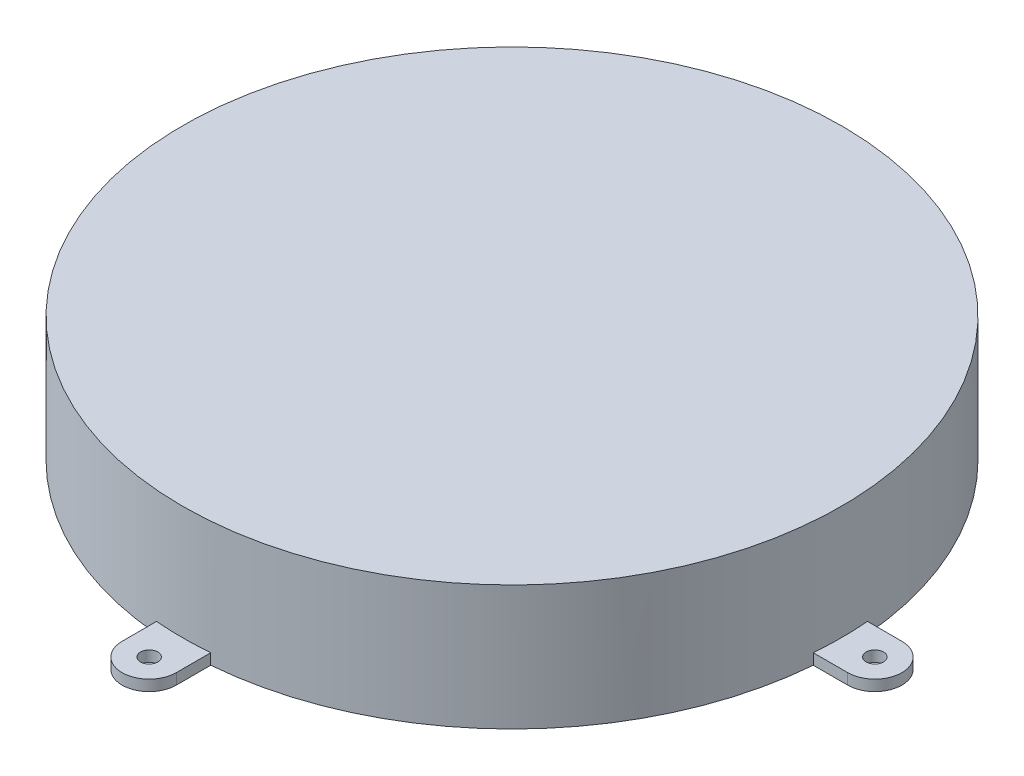
ISO-10303-21;
HEADER;
FILE_DESCRIPTION(('STEP AP214'),'2;1');
FILE_NAME('part.step','',(''),(''),'','','');
FILE_SCHEMA(('AUTOMOTIVE_DESIGN { 1 0 10303 214 1 1 1 1 }'));
ENDSEC;
DATA;
#1=APPLICATION_CONTEXT('core data for automotive mechanical design processes');
#2=APPLICATION_PROTOCOL_DEFINITION('international standard','automotive_design',2000,#1);
#3=PRODUCT_CONTEXT('',#1,'mechanical');
#4=PRODUCT('Part','Part','',(#3));
#5=PRODUCT_RELATED_PRODUCT_CATEGORY('part','',(#4));
#6=PRODUCT_DEFINITION_FORMATION('','',#4);
#7=PRODUCT_DEFINITION_CONTEXT('part definition',#1,'design');
#8=PRODUCT_DEFINITION('design','',#6,#7);
#9=PRODUCT_DEFINITION_SHAPE('','',#8);
#10=(LENGTH_UNIT() NAMED_UNIT(*) SI_UNIT(.MILLI.,.METRE.));
#11=(NAMED_UNIT(*) PLANE_ANGLE_UNIT() SI_UNIT($,.RADIAN.));
#12=(NAMED_UNIT(*) SI_UNIT($,.STERADIAN.) SOLID_ANGLE_UNIT());
#13=UNCERTAINTY_MEASURE_WITH_UNIT(LENGTH_MEASURE(1.E-05),#10,'distance_accuracy_value','');
#14=(GEOMETRIC_REPRESENTATION_CONTEXT(3) GLOBAL_UNCERTAINTY_ASSIGNED_CONTEXT((#13)) GLOBAL_UNIT_ASSIGNED_CONTEXT((#10,
#11,#12)) REPRESENTATION_CONTEXT('',''));
#15=CARTESIAN_POINT('',(0.,0.,0.));
#16=DIRECTION('',(0.,0.,1.));
#17=DIRECTION('',(1.,0.,0.));
#18=AXIS2_PLACEMENT_3D('',#15,#16,#17);
#19=CARTESIAN_POINT('',(0.,21.,0.));
#20=DIRECTION('',(0.,-1.,0.));
#21=DIRECTION('',(0.,0.,-1.));
#22=AXIS2_PLACEMENT_3D('',#19,#20,#21);
#23=CYLINDRICAL_SURFACE('',#22,60.75);
#24=CARTESIAN_POINT('',(0.,23.,0.));
#25=DIRECTION('',(0.,1.,0.));
#26=DIRECTION('',(0.,0.,1.));
#27=AXIS2_PLACEMENT_3D('',#24,#25,#26);
#28=CIRCLE('',#27,60.75);
#29=CARTESIAN_POINT('',(0.,23.,60.75));
#30=VERTEX_POINT('',#29);
#31=EDGE_CURVE('E268',#30,#30,#28,.T.);
#32=ORIENTED_EDGE('',*,*,#31,.F.);
#33=EDGE_LOOP('',(#32));
#34=FACE_BOUND('',#33,.T.);
#35=DIRECTION('',(0.,-1.,0.));
#36=VECTOR('',#35,1.);
#37=CARTESIAN_POINT('',(-60.5438890392746,2.,5.00000000000001));
#38=LINE('',#37,#36);
#39=CARTESIAN_POINT('',(-60.5438890392746,2.,5.00000000000003));
#40=VERTEX_POINT('',#39);
#41=CARTESIAN_POINT('',(-60.5438890392746,0.,5.00000000000003));
#42=VERTEX_POINT('',#41);
#43=EDGE_CURVE('E148',#40,#42,#38,.T.);
#44=ORIENTED_EDGE('',*,*,#43,.T.);
#45=CARTESIAN_POINT('',(0.,0.,0.));
#46=DIRECTION('',(0.,1.,0.));
#47=DIRECTION('',(0.,0.,1.));
#48=AXIS2_PLACEMENT_3D('',#45,#46,#47);
#49=CIRCLE('',#48,60.75);
#50=CARTESIAN_POINT('',(-4.99999999999999,0.,60.5438890392746));
#51=VERTEX_POINT('',#50);
#52=EDGE_CURVE('E281',#42,#51,#49,.T.);
#53=ORIENTED_EDGE('',*,*,#52,.T.);
#54=DIRECTION('',(0.,-1.,0.));
#55=VECTOR('',#54,1.);
#56=CARTESIAN_POINT('',(-4.99999999999999,2.,60.5438890392746));
#57=LINE('',#56,#55);
#58=CARTESIAN_POINT('',(-4.99999999999999,2.,60.5438890392746));
#59=VERTEX_POINT('',#58);
#60=EDGE_CURVE('E194',#59,#51,#57,.T.);
#61=ORIENTED_EDGE('',*,*,#60,.F.);
#62=CARTESIAN_POINT('',(0.,2.,0.));
#63=DIRECTION('',(0.,-1.,0.));
#64=DIRECTION('',(0.,0.,-1.));
#65=AXIS2_PLACEMENT_3D('',#62,#63,#64);
#66=CIRCLE('',#65,60.75);
#67=CARTESIAN_POINT('',(5.00000000000003,2.,60.5438890392746));
#68=VERTEX_POINT('',#67);
#69=EDGE_CURVE('E40',#68,#59,#66,.T.);
#70=ORIENTED_EDGE('',*,*,#69,.F.);
#71=DIRECTION('',(0.,-1.,0.));
#72=VECTOR('',#71,1.);
#73=CARTESIAN_POINT('',(5.,2.,60.5438890392746));
#74=LINE('',#73,#72);
#75=CARTESIAN_POINT('',(5.00000000000003,0.,60.5438890392746));
#76=VERTEX_POINT('',#75);
#77=EDGE_CURVE('E197',#68,#76,#74,.T.);
#78=ORIENTED_EDGE('',*,*,#77,.T.);
#79=CARTESIAN_POINT('',(60.5438890392746,0.,4.99999999999999));
#80=VERTEX_POINT('',#79);
#81=EDGE_CURVE('E304',#76,#80,#49,.T.);
#82=ORIENTED_EDGE('',*,*,#81,.T.);
#83=DIRECTION('',(0.,-1.,0.));
#84=VECTOR('',#83,1.);
#85=CARTESIAN_POINT('',(60.5438890392746,2.,4.99999999999999));
#86=LINE('',#85,#84);
#87=CARTESIAN_POINT('',(60.5438890392746,2.,4.99999999999999));
#88=VERTEX_POINT('',#87);
#89=EDGE_CURVE('E227',#88,#80,#86,.T.);
#90=ORIENTED_EDGE('',*,*,#89,.F.);
#91=CARTESIAN_POINT('',(0.,2.,0.));
#92=DIRECTION('',(0.,-1.,0.));
#93=DIRECTION('',(0.,0.,-1.));
#94=AXIS2_PLACEMENT_3D('',#91,#92,#93);
#95=CIRCLE('',#94,60.75);
#96=CARTESIAN_POINT('',(60.5438890392746,2.,-5.00000000000003));
#97=VERTEX_POINT('',#96);
#98=EDGE_CURVE('E284',#97,#88,#95,.T.);
#99=ORIENTED_EDGE('',*,*,#98,.F.);
#100=DIRECTION('',(0.,-1.,0.));
#101=VECTOR('',#100,1.);
#102=CARTESIAN_POINT('',(60.5438890392746,2.,-5.));
#103=LINE('',#102,#101);
#104=CARTESIAN_POINT('',(60.5438890392746,0.,-5.00000000000003));
#105=VERTEX_POINT('',#104);
#106=EDGE_CURVE('E230',#97,#105,#103,.T.);
#107=ORIENTED_EDGE('',*,*,#106,.T.);
#108=CARTESIAN_POINT('',(5.,0.,-60.5438890392746));
#109=VERTEX_POINT('',#108);
#110=EDGE_CURVE('E277',#105,#109,#49,.T.);
#111=ORIENTED_EDGE('',*,*,#110,.T.);
#112=DIRECTION('',(0.,-1.,0.));
#113=VECTOR('',#112,1.);
#114=CARTESIAN_POINT('',(5.,2.,-60.5438890392746));
#115=LINE('',#114,#113);
#116=CARTESIAN_POINT('',(5.,2.,-60.5438890392746));
#117=VERTEX_POINT('',#116);
#118=EDGE_CURVE('E260',#117,#109,#115,.T.);
#119=ORIENTED_EDGE('',*,*,#118,.F.);
#120=CARTESIAN_POINT('',(0.,2.,0.));
#121=DIRECTION('',(0.,-1.,0.));
#122=DIRECTION('',(0.,0.,-1.));
#123=AXIS2_PLACEMENT_3D('',#120,#121,#122);
#124=CIRCLE('',#123,60.75);
#125=CARTESIAN_POINT('',(-5.00000000000003,2.,-60.5438890392746));
#126=VERTEX_POINT('',#125);
#127=EDGE_CURVE('E280',#126,#117,#124,.T.);
#128=ORIENTED_EDGE('',*,*,#127,.F.);
#129=DIRECTION('',(0.,-1.,0.));
#130=VECTOR('',#129,1.);
#131=CARTESIAN_POINT('',(-5.,2.,-60.5438890392746));
#132=LINE('',#131,#130);
#133=CARTESIAN_POINT('',(-5.00000000000003,0.,-60.5438890392746));
#134=VERTEX_POINT('',#133);
#135=EDGE_CURVE('E263',#126,#134,#132,.T.);
#136=ORIENTED_EDGE('',*,*,#135,.T.);
#137=CARTESIAN_POINT('',(-60.5438890392746,0.,-4.99999999999998));
#138=VERTEX_POINT('',#137);
#139=EDGE_CURVE('E278',#134,#138,#49,.T.);
#140=ORIENTED_EDGE('',*,*,#139,.T.);
#141=DIRECTION('',(0.,-1.,0.));
#142=VECTOR('',#141,1.);
#143=CARTESIAN_POINT('',(-60.5438890392746,2.,-4.99999999999998));
#144=LINE('',#143,#142);
#145=CARTESIAN_POINT('',(-60.5438890392746,2.,-4.99999999999998));
#146=VERTEX_POINT('',#145);
#147=EDGE_CURVE('E50',#146,#138,#144,.T.);
#148=ORIENTED_EDGE('',*,*,#147,.F.);
#149=CARTESIAN_POINT('',(0.,2.,0.));
#150=DIRECTION('',(0.,-1.,0.));
#151=DIRECTION('',(0.,0.,-1.));
#152=AXIS2_PLACEMENT_3D('',#149,#150,#151);
#153=CIRCLE('',#152,60.75);
#154=EDGE_CURVE('E11',#40,#146,#153,.T.);
#155=ORIENTED_EDGE('',*,*,#154,.F.);
#156=EDGE_LOOP('',(#44,#53,#61,#70,#78,#82,#90,#99,#107,#111,#119,#128,#136,#140,#148,#155));
#157=FACE_BOUND('',#156,.T.);
#158=ADVANCED_FACE('F33',(#34,#157),#23,.T.);
#159=CARTESIAN_POINT('',(0.,0.,0.));
#160=DIRECTION('',(0.,1.,0.));
#161=DIRECTION('',(0.,0.,1.));
#162=AXIS2_PLACEMENT_3D('',#159,#160,#161);
#163=PLANE('',#162);
#164=ORIENTED_EDGE('',*,*,#52,.F.);
#165=DIRECTION('',(1.,0.,0.));
#166=VECTOR('',#165,1.);
#167=CARTESIAN_POINT('',(-60.5438890392746,0.,5.00000000000001));
#168=LINE('',#167,#166);
#169=CARTESIAN_POINT('',(-66.8938890392746,0.,5.00000000000001));
#170=VERTEX_POINT('',#169);
#171=EDGE_CURVE('E385',#170,#42,#168,.T.);
#172=ORIENTED_EDGE('',*,*,#171,.F.);
#173=CARTESIAN_POINT('',(-66.8938890392746,0.,0.));
#174=DIRECTION('',(0.,1.,0.));
#175=DIRECTION('',(0.,0.,-1.));
#176=AXIS2_PLACEMENT_3D('',#173,#174,#175);
#177=CIRCLE('',#176,5.);
#178=CARTESIAN_POINT('',(-66.8938890392746,0.,-4.99999999999999));
#179=VERTEX_POINT('',#178);
#180=EDGE_CURVE('E164',#179,#170,#177,.T.);
#181=ORIENTED_EDGE('',*,*,#180,.F.);
#182=DIRECTION('',(-1.,0.,0.));
#183=VECTOR('',#182,1.);
#184=CARTESIAN_POINT('',(-66.8938890392746,0.,-4.99999999999999));
#185=LINE('',#184,#183);
#186=EDGE_CURVE('E160',#138,#179,#185,.T.);
#187=ORIENTED_EDGE('',*,*,#186,.F.);
#188=ORIENTED_EDGE('',*,*,#139,.F.);
#189=DIRECTION('',(0.,0.,1.));
#190=VECTOR('',#189,1.);
#191=CARTESIAN_POINT('',(-5.,0.,-60.5438890392746));
#192=LINE('',#191,#190);
#193=CARTESIAN_POINT('',(-5.,0.,-66.8938890392746));
#194=VERTEX_POINT('',#193);
#195=EDGE_CURVE('E254',#194,#134,#192,.T.);
#196=ORIENTED_EDGE('',*,*,#195,.F.);
#197=CARTESIAN_POINT('',(0.,0.,-66.8938890392746));
#198=DIRECTION('',(0.,1.,0.));
#199=DIRECTION('',(0.,0.,-1.));
#200=AXIS2_PLACEMENT_3D('',#197,#198,#199);
#201=CIRCLE('',#200,5.);
#202=CARTESIAN_POINT('',(5.,0.,-66.8938890392746));
#203=VERTEX_POINT('',#202);
#204=EDGE_CURVE('E239',#203,#194,#201,.T.);
#205=ORIENTED_EDGE('',*,*,#204,.F.);
#206=DIRECTION('',(0.,0.,-1.));
#207=VECTOR('',#206,1.);
#208=CARTESIAN_POINT('',(5.,0.,-66.8938890392746));
#209=LINE('',#208,#207);
#210=EDGE_CURVE('E246',#109,#203,#209,.T.);
#211=ORIENTED_EDGE('',*,*,#210,.F.);
#212=ORIENTED_EDGE('',*,*,#110,.F.);
#213=DIRECTION('',(-1.,0.,0.));
#214=VECTOR('',#213,1.);
#215=CARTESIAN_POINT('',(60.5438890392746,0.,-5.));
#216=LINE('',#215,#214);
#217=CARTESIAN_POINT('',(66.8938890392746,0.,-5.));
#218=VERTEX_POINT('',#217);
#219=EDGE_CURVE('E221',#218,#105,#216,.T.);
#220=ORIENTED_EDGE('',*,*,#219,.F.);
#221=CARTESIAN_POINT('',(66.8938890392746,0.,0.));
#222=DIRECTION('',(0.,1.,0.));
#223=DIRECTION('',(0.,0.,-1.));
#224=AXIS2_PLACEMENT_3D('',#221,#222,#223);
#225=CIRCLE('',#224,5.);
#226=CARTESIAN_POINT('',(66.8938890392746,0.,5.));
#227=VERTEX_POINT('',#226);
#228=EDGE_CURVE('E206',#227,#218,#225,.T.);
#229=ORIENTED_EDGE('',*,*,#228,.F.);
#230=DIRECTION('',(1.,0.,0.));
#231=VECTOR('',#230,1.);
#232=CARTESIAN_POINT('',(66.8938890392746,0.,5.));
#233=LINE('',#232,#231);
#234=EDGE_CURVE('E213',#80,#227,#233,.T.);
#235=ORIENTED_EDGE('',*,*,#234,.F.);
#236=ORIENTED_EDGE('',*,*,#81,.F.);
#237=DIRECTION('',(0.,0.,-1.));
#238=VECTOR('',#237,1.);
#239=CARTESIAN_POINT('',(5.,0.,60.5438890392746));
#240=LINE('',#239,#238);
#241=CARTESIAN_POINT('',(5.00000000000001,0.,66.8938890392746));
#242=VERTEX_POINT('',#241);
#243=EDGE_CURVE('E188',#242,#76,#240,.T.);
#244=ORIENTED_EDGE('',*,*,#243,.F.);
#245=CARTESIAN_POINT('',(0.,0.,66.8938890392746));
#246=DIRECTION('',(0.,1.,0.));
#247=DIRECTION('',(0.,0.,-1.));
#248=AXIS2_PLACEMENT_3D('',#245,#246,#247);
#249=CIRCLE('',#248,5.);
#250=CARTESIAN_POINT('',(-4.99999999999999,0.,66.8938890392746));
#251=VERTEX_POINT('',#250);
#252=EDGE_CURVE('E174',#251,#242,#249,.T.);
#253=ORIENTED_EDGE('',*,*,#252,.F.);
#254=DIRECTION('',(0.,0.,1.));
#255=VECTOR('',#254,1.);
#256=CARTESIAN_POINT('',(-4.99999999999999,0.,66.8938890392746));
#257=LINE('',#256,#255);
#258=EDGE_CURVE('E180',#51,#251,#257,.T.);
#259=ORIENTED_EDGE('',*,*,#258,.F.);
#260=EDGE_LOOP('',(#164,#172,#181,#187,#188,#196,#205,#211,#212,#220,#229,#235,#236,#244,#253,#259));
#261=FACE_BOUND('',#260,.T.);
#262=CARTESIAN_POINT('',(0.,0.,66.8938890392746));
#263=DIRECTION('',(0.,1.,0.));
#264=DIRECTION('',(0.,0.,1.));
#265=AXIS2_PLACEMENT_3D('',#262,#263,#264);
#266=CIRCLE('',#265,1.60000000000024);
#267=CARTESIAN_POINT('',(0.,0.,68.4938890392749));
#268=VERTEX_POINT('',#267);
#269=EDGE_CURVE('E165',#268,#268,#266,.T.);
#270=ORIENTED_EDGE('',*,*,#269,.T.);
#271=EDGE_LOOP('',(#270));
#272=FACE_BOUND('',#271,.T.);
#273=CARTESIAN_POINT('',(0.,0.,0.));
#274=DIRECTION('',(0.,1.,0.));
#275=DIRECTION('',(0.,0.,1.));
#276=AXIS2_PLACEMENT_3D('',#273,#274,#275);
#277=CIRCLE('',#276,59.75);
#278=CARTESIAN_POINT('',(0.,0.,-59.75));
#279=VERTEX_POINT('',#278);
#280=EDGE_CURVE('E274',#279,#279,#277,.T.);
#281=ORIENTED_EDGE('',*,*,#280,.T.);
#282=EDGE_LOOP('',(#281));
#283=FACE_BOUND('',#282,.T.);
#284=CARTESIAN_POINT('',(0.,0.,-66.8938890392746));
#285=DIRECTION('',(0.,1.,0.));
#286=DIRECTION('',(0.,0.,1.));
#287=AXIS2_PLACEMENT_3D('',#284,#285,#286);
#288=CIRCLE('',#287,1.60000000000001);
#289=CARTESIAN_POINT('',(0.,0.,-65.2938890392746));
#290=VERTEX_POINT('',#289);
#291=EDGE_CURVE('E235',#290,#290,#288,.T.);
#292=ORIENTED_EDGE('',*,*,#291,.T.);
#293=EDGE_LOOP('',(#292));
#294=FACE_BOUND('',#293,.T.);
#295=CARTESIAN_POINT('',(66.8938890392746,0.,0.));
#296=DIRECTION('',(0.,1.,0.));
#297=DIRECTION('',(0.,0.,1.));
#298=AXIS2_PLACEMENT_3D('',#295,#296,#297);
#299=CIRCLE('',#298,1.60000000000031);
#300=CARTESIAN_POINT('',(66.8938890392746,0.,1.60000000000031));
#301=VERTEX_POINT('',#300);
#302=EDGE_CURVE('E202',#301,#301,#299,.T.);
#303=ORIENTED_EDGE('',*,*,#302,.T.);
#304=EDGE_LOOP('',(#303));
#305=FACE_BOUND('',#304,.T.);
#306=CARTESIAN_POINT('',(-66.8938890392746,0.,0.));
#307=DIRECTION('',(0.,1.,0.));
#308=DIRECTION('',(0.,0.,1.));
#309=AXIS2_PLACEMENT_3D('',#306,#307,#308);
#310=CIRCLE('',#309,1.60000000000001);
#311=CARTESIAN_POINT('',(-66.8938890392746,0.,1.60000000000002));
#312=VERTEX_POINT('',#311);
#313=EDGE_CURVE('E375',#312,#312,#310,.T.);
#314=ORIENTED_EDGE('',*,*,#313,.T.);
#315=EDGE_LOOP('',(#314));
#316=FACE_BOUND('',#315,.T.);
#317=ADVANCED_FACE('F308',(#261,#272,#283,#294,#305,#316),#163,.F.);
#318=CARTESIAN_POINT('',(0.,21.,0.));
#319=DIRECTION('',(0.,-1.,0.));
#320=DIRECTION('',(0.,0.,-1.));
#321=AXIS2_PLACEMENT_3D('',#318,#319,#320);
#322=CYLINDRICAL_SURFACE('',#321,59.75);
#323=CARTESIAN_POINT('',(0.,21.,0.));
#324=DIRECTION('',(0.,1.,0.));
#325=DIRECTION('',(0.,0.,1.));
#326=AXIS2_PLACEMENT_3D('',#323,#324,#325);
#327=CIRCLE('',#326,59.75);
#328=CARTESIAN_POINT('',(0.,21.,-59.75));
#329=VERTEX_POINT('',#328);
#330=EDGE_CURVE('E271',#329,#329,#327,.T.);
#331=CARTESIAN_POINT('',(0.,21.,-59.75));
#332=CARTESIAN_POINT('',(0.,20.78125,-59.75));
#333=CARTESIAN_POINT('',(0.,20.5625,-59.75));
#334=CARTESIAN_POINT('',(0.,20.125,-59.75));
#335=CARTESIAN_POINT('',(0.,19.90625,-59.75));
#336=CARTESIAN_POINT('',(0.,19.46875,-59.75));
#337=CARTESIAN_POINT('',(0.,19.25,-59.75));
#338=CARTESIAN_POINT('',(0.,18.8125,-59.75));
#339=CARTESIAN_POINT('',(0.,18.59375,-59.75));
#340=CARTESIAN_POINT('',(0.,18.15625,-59.75));
#341=CARTESIAN_POINT('',(0.,17.9375,-59.75));
#342=CARTESIAN_POINT('',(0.,17.5,-59.75));
#343=CARTESIAN_POINT('',(0.,17.28125,-59.75));
#344=CARTESIAN_POINT('',(0.,16.84375,-59.75));
#345=CARTESIAN_POINT('',(0.,16.625,-59.75));
#346=CARTESIAN_POINT('',(0.,16.1875,-59.75));
#347=CARTESIAN_POINT('',(0.,15.96875,-59.75));
#348=CARTESIAN_POINT('',(0.,15.53125,-59.75));
#349=CARTESIAN_POINT('',(0.,15.3125,-59.75));
#350=CARTESIAN_POINT('',(0.,14.875,-59.75));
#351=CARTESIAN_POINT('',(0.,14.65625,-59.75));
#352=CARTESIAN_POINT('',(0.,14.21875,-59.75));
#353=CARTESIAN_POINT('',(0.,14.,-59.75));
#354=CARTESIAN_POINT('',(0.,13.5625,-59.75));
#355=CARTESIAN_POINT('',(0.,13.34375,-59.75));
#356=CARTESIAN_POINT('',(0.,12.90625,-59.75));
#357=CARTESIAN_POINT('',(0.,12.6875,-59.75));
#358=CARTESIAN_POINT('',(0.,12.25,-59.75));
#359=CARTESIAN_POINT('',(0.,12.03125,-59.75));
#360=CARTESIAN_POINT('',(0.,11.59375,-59.75));
#361=CARTESIAN_POINT('',(0.,11.375,-59.75));
#362=CARTESIAN_POINT('',(0.,10.9375,-59.75));
#363=CARTESIAN_POINT('',(0.,10.71875,-59.75));
#364=CARTESIAN_POINT('',(0.,10.28125,-59.75));
#365=CARTESIAN_POINT('',(0.,10.0625,-59.75));
#366=CARTESIAN_POINT('',(0.,9.625,-59.75));
#367=CARTESIAN_POINT('',(0.,9.40625,-59.75));
#368=CARTESIAN_POINT('',(0.,8.96875,-59.75));
#369=CARTESIAN_POINT('',(0.,8.75,-59.75));
#370=CARTESIAN_POINT('',(0.,8.3125,-59.75));
#371=CARTESIAN_POINT('',(0.,8.09375,-59.75));
#372=CARTESIAN_POINT('',(0.,7.65625,-59.75));
#373=CARTESIAN_POINT('',(0.,7.4375,-59.75));
#374=CARTESIAN_POINT('',(0.,7.,-59.75));
#375=CARTESIAN_POINT('',(0.,6.78125,-59.75));
#376=CARTESIAN_POINT('',(0.,6.34375,-59.75));
#377=CARTESIAN_POINT('',(0.,6.125,-59.75));
#378=CARTESIAN_POINT('',(0.,5.6875,-59.75));
#379=CARTESIAN_POINT('',(0.,5.46875,-59.75));
#380=CARTESIAN_POINT('',(0.,5.03125,-59.75));
#381=CARTESIAN_POINT('',(0.,4.8125,-59.75));
#382=CARTESIAN_POINT('',(0.,4.375,-59.75));
#383=CARTESIAN_POINT('',(0.,4.15625,-59.75));
#384=CARTESIAN_POINT('',(0.,3.71875,-59.75));
#385=CARTESIAN_POINT('',(0.,3.5,-59.75));
#386=CARTESIAN_POINT('',(0.,3.0625,-59.75));
#387=CARTESIAN_POINT('',(0.,2.84375,-59.75));
#388=CARTESIAN_POINT('',(0.,2.40625,-59.75));
#389=CARTESIAN_POINT('',(0.,2.1875,-59.75));
#390=CARTESIAN_POINT('',(0.,1.75,-59.75));
#391=CARTESIAN_POINT('',(0.,1.53125,-59.75));
#392=CARTESIAN_POINT('',(0.,1.09375,-59.75));
#393=CARTESIAN_POINT('',(0.,0.875000000000001,-59.75));
#394=CARTESIAN_POINT('',(0.,0.4375,-59.75));
#395=CARTESIAN_POINT('',(0.,0.21875,-59.75));
#396=CARTESIAN_POINT('',(0.,0.,-59.75));
#397=B_SPLINE_CURVE_WITH_KNOTS('',3,(#331,#332,#333,#334,#335,#336,#337,#338,#339,#340,#341,
#342,#343,#344,#345,#346,#347,#348,#349,#350,#351,#352,#353,#354,#355,#356,#357,#358,#359,#360,
#361,#362,#363,#364,#365,#366,#367,#368,#369,#370,#371,#372,#373,#374,#375,#376,#377,#378,#379,
#380,#381,#382,#383,#384,#385,#386,#387,#388,#389,#390,#391,#392,#393,#394,#395,#396),
.UNSPECIFIED.,.F.,.F.,(4,2,2,2,2,2,2,2,2,2,2,2,2,2,2,2,2,2,2,2,2,2,2,2,2,2,2,2,2,2,2,2,4),(0.,
0.656249999999997,1.3125,1.96875,2.625,3.28125,3.9375,4.59375,5.25,5.90625,6.5625,7.21875,7.875,
8.53125,9.1875,9.84375,10.5,11.15625,11.8125,12.46875,13.125,13.78125,14.4375,15.09375,15.75,
16.40625,17.0625,17.71875,18.375,19.03125,19.6875,20.34375,21.),.UNSPECIFIED.);
#398=EDGE_CURVE('BSEAM345',#329,#279,#397,.T.);
#399=ORIENTED_EDGE('',*,*,#330,.T.);
#400=ORIENTED_EDGE('',*,*,#280,.F.);
#401=ORIENTED_EDGE('',*,*,#398,.T.);
#402=ORIENTED_EDGE('',*,*,#398,.F.);
#403=EDGE_LOOP('',(#399,#401,#400,#402));
#404=FACE_BOUND('',#403,.T.);
#405=ADVANCED_FACE('F345',(#404),#322,.F.);
#406=CARTESIAN_POINT('',(0.,21.,0.));
#407=DIRECTION('',(0.,1.,0.));
#408=DIRECTION('',(0.,0.,1.));
#409=AXIS2_PLACEMENT_3D('',#406,#407,#408);
#410=PLANE('',#409);
#411=ORIENTED_EDGE('',*,*,#330,.F.);
#412=EDGE_LOOP('',(#411));
#413=FACE_BOUND('',#412,.T.);
#414=ADVANCED_FACE('F350',(#413),#410,.F.);
#415=CARTESIAN_POINT('',(0.,23.,0.));
#416=DIRECTION('',(0.,1.,0.));
#417=DIRECTION('',(0.,0.,1.));
#418=AXIS2_PLACEMENT_3D('',#415,#416,#417);
#419=PLANE('',#418);
#420=ORIENTED_EDGE('',*,*,#31,.T.);
#421=EDGE_LOOP('',(#420));
#422=FACE_BOUND('',#421,.T.);
#423=ADVANCED_FACE('F348',(#422),#419,.T.);
#424=CARTESIAN_POINT('',(0.,2.,-66.8938890392746));
#425=DIRECTION('',(0.,-1.,0.));
#426=DIRECTION('',(0.,0.,-1.));
#427=AXIS2_PLACEMENT_3D('',#424,#425,#426);
#428=PLANE('',#427);
#429=DIRECTION('',(0.,0.,1.));
#430=VECTOR('',#429,1.);
#431=CARTESIAN_POINT('',(-5.,2.,-60.5438890392746));
#432=LINE('',#431,#430);
#433=CARTESIAN_POINT('',(-5.,2.,-66.8938890392746));
#434=VERTEX_POINT('',#433);
#435=EDGE_CURVE('E245',#434,#126,#432,.T.);
#436=ORIENTED_EDGE('',*,*,#435,.T.);
#437=ORIENTED_EDGE('',*,*,#127,.T.);
#438=DIRECTION('',(0.,0.,-1.));
#439=VECTOR('',#438,1.);
#440=CARTESIAN_POINT('',(5.,2.,-66.8938890392746));
#441=LINE('',#440,#439);
#442=CARTESIAN_POINT('',(5.,2.,-66.8938890392746));
#443=VERTEX_POINT('',#442);
#444=EDGE_CURVE('E249',#117,#443,#441,.T.);
#445=ORIENTED_EDGE('',*,*,#444,.T.);
#446=CARTESIAN_POINT('',(0.,2.,-66.8938890392746));
#447=DIRECTION('',(0.,1.,0.));
#448=DIRECTION('',(0.,0.,-1.));
#449=AXIS2_PLACEMENT_3D('',#446,#447,#448);
#450=CIRCLE('',#449,5.);
#451=EDGE_CURVE('E242',#443,#434,#450,.T.);
#452=ORIENTED_EDGE('',*,*,#451,.T.);
#453=EDGE_LOOP('',(#436,#437,#445,#452));
#454=FACE_BOUND('',#453,.T.);
#455=CARTESIAN_POINT('',(0.,2.,-66.8938890392746));
#456=DIRECTION('',(0.,1.,0.));
#457=DIRECTION('',(0.,0.,1.));
#458=AXIS2_PLACEMENT_3D('',#455,#456,#457);
#459=CIRCLE('',#458,1.60000000000001);
#460=CARTESIAN_POINT('',(0.,2.,-65.2938890392746));
#461=VERTEX_POINT('',#460);
#462=EDGE_CURVE('E236',#461,#461,#459,.T.);
#463=ORIENTED_EDGE('',*,*,#462,.F.);
#464=EDGE_LOOP('',(#463));
#465=FACE_BOUND('',#464,.T.);
#466=ADVANCED_FACE('F325',(#454,#465),#428,.F.);
#467=CARTESIAN_POINT('',(0.,2.,-66.8938890392746));
#468=DIRECTION('',(0.,-1.,0.));
#469=DIRECTION('',(0.,0.,-1.));
#470=AXIS2_PLACEMENT_3D('',#467,#468,#469);
#471=CYLINDRICAL_SURFACE('',#470,5.);
#472=ORIENTED_EDGE('',*,*,#204,.T.);
#473=DIRECTION('',(0.,-1.,0.));
#474=VECTOR('',#473,1.);
#475=CARTESIAN_POINT('',(-5.,2.,-66.8938890392746));
#476=LINE('',#475,#474);
#477=EDGE_CURVE('E265',#434,#194,#476,.T.);
#478=ORIENTED_EDGE('',*,*,#477,.F.);
#479=ORIENTED_EDGE('',*,*,#451,.F.);
#480=DIRECTION('',(0.,-1.,0.));
#481=VECTOR('',#480,1.);
#482=CARTESIAN_POINT('',(5.,2.,-66.8938890392746));
#483=LINE('',#482,#481);
#484=EDGE_CURVE('E251',#443,#203,#483,.T.);
#485=ORIENTED_EDGE('',*,*,#484,.T.);
#486=EDGE_LOOP('',(#472,#478,#479,#485));
#487=FACE_BOUND('',#486,.T.);
#488=ADVANCED_FACE('F322',(#487),#471,.T.);
#489=CARTESIAN_POINT('',(-5.,2.,-60.5438890392746));
#490=DIRECTION('',(1.,0.,0.));
#491=DIRECTION('',(0.,0.,-1.));
#492=AXIS2_PLACEMENT_3D('',#489,#490,#491);
#493=PLANE('',#492);
#494=ORIENTED_EDGE('',*,*,#195,.T.);
#495=ORIENTED_EDGE('',*,*,#135,.F.);
#496=ORIENTED_EDGE('',*,*,#435,.F.);
#497=ORIENTED_EDGE('',*,*,#477,.T.);
#498=EDGE_LOOP('',(#494,#495,#496,#497));
#499=FACE_BOUND('',#498,.T.);
#500=ADVANCED_FACE('F330',(#499),#493,.F.);
#501=CARTESIAN_POINT('',(5.,2.,-66.8938890392746));
#502=DIRECTION('',(-1.,0.,0.));
#503=DIRECTION('',(0.,0.,1.));
#504=AXIS2_PLACEMENT_3D('',#501,#502,#503);
#505=PLANE('',#504);
#506=ORIENTED_EDGE('',*,*,#210,.T.);
#507=ORIENTED_EDGE('',*,*,#484,.F.);
#508=ORIENTED_EDGE('',*,*,#444,.F.);
#509=ORIENTED_EDGE('',*,*,#118,.T.);
#510=EDGE_LOOP('',(#506,#507,#508,#509));
#511=FACE_BOUND('',#510,.T.);
#512=ADVANCED_FACE('F316',(#511),#505,.F.);
#513=CARTESIAN_POINT('',(0.,2.,-66.8938890392746));
#514=DIRECTION('',(0.,-1.,0.));
#515=DIRECTION('',(0.,0.,-1.));
#516=AXIS2_PLACEMENT_3D('',#513,#514,#515);
#517=CYLINDRICAL_SURFACE('',#516,1.60000000000001);
#518=ORIENTED_EDGE('',*,*,#462,.T.);
#519=EDGE_LOOP('',(#518));
#520=FACE_BOUND('',#519,.T.);
#521=ORIENTED_EDGE('',*,*,#291,.F.);
#522=EDGE_LOOP('',(#521));
#523=FACE_BOUND('',#522,.T.);
#524=ADVANCED_FACE('F337',(#520,#523),#517,.F.);
#525=CARTESIAN_POINT('',(66.8938890392746,2.,0.));
#526=DIRECTION('',(0.,-1.,0.));
#527=DIRECTION('',(0.,0.,-1.));
#528=AXIS2_PLACEMENT_3D('',#525,#526,#527);
#529=PLANE('',#528);
#530=DIRECTION('',(-1.,0.,0.));
#531=VECTOR('',#530,1.);
#532=CARTESIAN_POINT('',(60.5438890392746,2.,-5.));
#533=LINE('',#532,#531);
#534=CARTESIAN_POINT('',(66.8938890392746,2.,-5.));
#535=VERTEX_POINT('',#534);
#536=EDGE_CURVE('E212',#535,#97,#533,.T.);
#537=ORIENTED_EDGE('',*,*,#536,.T.);
#538=ORIENTED_EDGE('',*,*,#98,.T.);
#539=DIRECTION('',(1.,0.,0.));
#540=VECTOR('',#539,1.);
#541=CARTESIAN_POINT('',(66.8938890392746,2.,5.));
#542=LINE('',#541,#540);
#543=CARTESIAN_POINT('',(66.8938890392746,2.,5.));
#544=VERTEX_POINT('',#543);
#545=EDGE_CURVE('E216',#88,#544,#542,.T.);
#546=ORIENTED_EDGE('',*,*,#545,.T.);
#547=CARTESIAN_POINT('',(66.8938890392746,2.,0.));
#548=DIRECTION('',(0.,1.,0.));
#549=DIRECTION('',(0.,0.,-1.));
#550=AXIS2_PLACEMENT_3D('',#547,#548,#549);
#551=CIRCLE('',#550,5.);
#552=EDGE_CURVE('E209',#544,#535,#551,.T.);
#553=ORIENTED_EDGE('',*,*,#552,.T.);
#554=EDGE_LOOP('',(#537,#538,#546,#553));
#555=FACE_BOUND('',#554,.T.);
#556=CARTESIAN_POINT('',(66.8938890392746,2.,0.));
#557=DIRECTION('',(0.,1.,0.));
#558=DIRECTION('',(0.,0.,1.));
#559=AXIS2_PLACEMENT_3D('',#556,#557,#558);
#560=CIRCLE('',#559,1.60000000000031);
#561=CARTESIAN_POINT('',(66.8938890392746,2.,1.60000000000031));
#562=VERTEX_POINT('',#561);
#563=EDGE_CURVE('E203',#562,#562,#560,.T.);
#564=ORIENTED_EDGE('',*,*,#563,.F.);
#565=EDGE_LOOP('',(#564));
#566=FACE_BOUND('',#565,.T.);
#567=ADVANCED_FACE('F421',(#555,#566),#529,.F.);
#568=CARTESIAN_POINT('',(66.8938890392746,2.,0.));
#569=DIRECTION('',(0.,-1.,0.));
#570=DIRECTION('',(0.,0.,-1.));
#571=AXIS2_PLACEMENT_3D('',#568,#569,#570);
#572=CYLINDRICAL_SURFACE('',#571,5.);
#573=ORIENTED_EDGE('',*,*,#228,.T.);
#574=DIRECTION('',(0.,-1.,0.));
#575=VECTOR('',#574,1.);
#576=CARTESIAN_POINT('',(66.8938890392746,2.,-5.));
#577=LINE('',#576,#575);
#578=EDGE_CURVE('E232',#535,#218,#577,.T.);
#579=ORIENTED_EDGE('',*,*,#578,.F.);
#580=ORIENTED_EDGE('',*,*,#552,.F.);
#581=DIRECTION('',(0.,-1.,0.));
#582=VECTOR('',#581,1.);
#583=CARTESIAN_POINT('',(66.8938890392746,2.,5.));
#584=LINE('',#583,#582);
#585=EDGE_CURVE('E218',#544,#227,#584,.T.);
#586=ORIENTED_EDGE('',*,*,#585,.T.);
#587=EDGE_LOOP('',(#573,#579,#580,#586));
#588=FACE_BOUND('',#587,.T.);
#589=ADVANCED_FACE('F424',(#588),#572,.T.);
#590=CARTESIAN_POINT('',(60.5438890392746,2.,-5.));
#591=DIRECTION('',(0.,0.,1.));
#592=DIRECTION('',(1.,0.,0.));
#593=AXIS2_PLACEMENT_3D('',#590,#591,#592);
#594=PLANE('',#593);
#595=ORIENTED_EDGE('',*,*,#219,.T.);
#596=ORIENTED_EDGE('',*,*,#106,.F.);
#597=ORIENTED_EDGE('',*,*,#536,.F.);
#598=ORIENTED_EDGE('',*,*,#578,.T.);
#599=EDGE_LOOP('',(#595,#596,#597,#598));
#600=FACE_BOUND('',#599,.T.);
#601=ADVANCED_FACE('F428',(#600),#594,.F.);
#602=CARTESIAN_POINT('',(66.8938890392746,2.,5.));
#603=DIRECTION('',(0.,0.,-1.));
#604=DIRECTION('',(-1.,0.,0.));
#605=AXIS2_PLACEMENT_3D('',#602,#603,#604);
#606=PLANE('',#605);
#607=ORIENTED_EDGE('',*,*,#234,.T.);
#608=ORIENTED_EDGE('',*,*,#585,.F.);
#609=ORIENTED_EDGE('',*,*,#545,.F.);
#610=ORIENTED_EDGE('',*,*,#89,.T.);
#611=EDGE_LOOP('',(#607,#608,#609,#610));
#612=FACE_BOUND('',#611,.T.);
#613=ADVANCED_FACE('F419',(#612),#606,.F.);
#614=CARTESIAN_POINT('',(66.8938890392746,2.,0.));
#615=DIRECTION('',(0.,-1.,0.));
#616=DIRECTION('',(0.,0.,-1.));
#617=AXIS2_PLACEMENT_3D('',#614,#615,#616);
#618=CYLINDRICAL_SURFACE('',#617,1.60000000000031);
#619=ORIENTED_EDGE('',*,*,#563,.T.);
#620=EDGE_LOOP('',(#619));
#621=FACE_BOUND('',#620,.T.);
#622=ORIENTED_EDGE('',*,*,#302,.F.);
#623=EDGE_LOOP('',(#622));
#624=FACE_BOUND('',#623,.T.);
#625=ADVANCED_FACE('F410',(#621,#624),#618,.F.);
#626=CARTESIAN_POINT('',(0.,2.,66.8938890392746));
#627=DIRECTION('',(0.,-1.,0.));
#628=DIRECTION('',(0.,0.,-1.));
#629=AXIS2_PLACEMENT_3D('',#626,#627,#628);
#630=PLANE('',#629);
#631=DIRECTION('',(0.,0.,-1.));
#632=VECTOR('',#631,1.);
#633=CARTESIAN_POINT('',(5.,2.,60.5438890392746));
#634=LINE('',#633,#632);
#635=CARTESIAN_POINT('',(5.00000000000001,2.,66.8938890392746));
#636=VERTEX_POINT('',#635);
#637=EDGE_CURVE('E179',#636,#68,#634,.T.);
#638=ORIENTED_EDGE('',*,*,#637,.T.);
#639=ORIENTED_EDGE('',*,*,#69,.T.);
#640=DIRECTION('',(0.,0.,1.));
#641=VECTOR('',#640,1.);
#642=CARTESIAN_POINT('',(-4.99999999999999,2.,66.8938890392746));
#643=LINE('',#642,#641);
#644=CARTESIAN_POINT('',(-4.99999999999999,2.,66.8938890392746));
#645=VERTEX_POINT('',#644);
#646=EDGE_CURVE('E183',#59,#645,#643,.T.);
#647=ORIENTED_EDGE('',*,*,#646,.T.);
#648=CARTESIAN_POINT('',(0.,2.,66.8938890392746));
#649=DIRECTION('',(0.,1.,0.));
#650=DIRECTION('',(0.,0.,-1.));
#651=AXIS2_PLACEMENT_3D('',#648,#649,#650);
#652=CIRCLE('',#651,5.);
#653=EDGE_CURVE('E176',#645,#636,#652,.T.);
#654=ORIENTED_EDGE('',*,*,#653,.T.);
#655=EDGE_LOOP('',(#638,#639,#647,#654));
#656=FACE_BOUND('',#655,.T.);
#657=CARTESIAN_POINT('',(0.,2.,66.8938890392746));
#658=DIRECTION('',(0.,1.,0.));
#659=DIRECTION('',(0.,0.,1.));
#660=AXIS2_PLACEMENT_3D('',#657,#658,#659);
#661=CIRCLE('',#660,1.60000000000024);
#662=CARTESIAN_POINT('',(0.,2.,68.4938890392749));
#663=VERTEX_POINT('',#662);
#664=EDGE_CURVE('E168',#663,#663,#661,.T.);
#665=ORIENTED_EDGE('',*,*,#664,.F.);
#666=EDGE_LOOP('',(#665));
#667=FACE_BOUND('',#666,.T.);
#668=ADVANCED_FACE('F289',(#656,#667),#630,.F.);
#669=CARTESIAN_POINT('',(0.,2.,66.8938890392746));
#670=DIRECTION('',(0.,-1.,0.));
#671=DIRECTION('',(0.,0.,-1.));
#672=AXIS2_PLACEMENT_3D('',#669,#670,#671);
#673=CYLINDRICAL_SURFACE('',#672,5.);
#674=ORIENTED_EDGE('',*,*,#252,.T.);
#675=DIRECTION('',(0.,-1.,0.));
#676=VECTOR('',#675,1.);
#677=CARTESIAN_POINT('',(5.00000000000001,2.,66.8938890392746));
#678=LINE('',#677,#676);
#679=EDGE_CURVE('E199',#636,#242,#678,.T.);
#680=ORIENTED_EDGE('',*,*,#679,.F.);
#681=ORIENTED_EDGE('',*,*,#653,.F.);
#682=DIRECTION('',(0.,-1.,0.));
#683=VECTOR('',#682,1.);
#684=CARTESIAN_POINT('',(-4.99999999999999,2.,66.8938890392746));
#685=LINE('',#684,#683);
#686=EDGE_CURVE('E185',#645,#251,#685,.T.);
#687=ORIENTED_EDGE('',*,*,#686,.T.);
#688=EDGE_LOOP('',(#674,#680,#681,#687));
#689=FACE_BOUND('',#688,.T.);
#690=ADVANCED_FACE('F300',(#689),#673,.T.);
#691=CARTESIAN_POINT('',(5.,2.,60.5438890392746));
#692=DIRECTION('',(-1.,0.,0.));
#693=DIRECTION('',(0.,0.,1.));
#694=AXIS2_PLACEMENT_3D('',#691,#692,#693);
#695=PLANE('',#694);
#696=ORIENTED_EDGE('',*,*,#243,.T.);
#697=ORIENTED_EDGE('',*,*,#77,.F.);
#698=ORIENTED_EDGE('',*,*,#637,.F.);
#699=ORIENTED_EDGE('',*,*,#679,.T.);
#700=EDGE_LOOP('',(#696,#697,#698,#699));
#701=FACE_BOUND('',#700,.T.);
#702=ADVANCED_FACE('F302',(#701),#695,.F.);
#703=CARTESIAN_POINT('',(-4.99999999999999,2.,66.8938890392746));
#704=DIRECTION('',(1.,0.,0.));
#705=DIRECTION('',(0.,0.,-1.));
#706=AXIS2_PLACEMENT_3D('',#703,#704,#705);
#707=PLANE('',#706);
#708=ORIENTED_EDGE('',*,*,#258,.T.);
#709=ORIENTED_EDGE('',*,*,#686,.F.);
#710=ORIENTED_EDGE('',*,*,#646,.F.);
#711=ORIENTED_EDGE('',*,*,#60,.T.);
#712=EDGE_LOOP('',(#708,#709,#710,#711));
#713=FACE_BOUND('',#712,.T.);
#714=ADVANCED_FACE('F294',(#713),#707,.F.);
#715=CARTESIAN_POINT('',(0.,2.,66.8938890392746));
#716=DIRECTION('',(0.,-1.,0.));
#717=DIRECTION('',(0.,0.,-1.));
#718=AXIS2_PLACEMENT_3D('',#715,#716,#717);
#719=CYLINDRICAL_SURFACE('',#718,1.60000000000024);
#720=ORIENTED_EDGE('',*,*,#664,.T.);
#721=EDGE_LOOP('',(#720));
#722=FACE_BOUND('',#721,.T.);
#723=ORIENTED_EDGE('',*,*,#269,.F.);
#724=EDGE_LOOP('',(#723));
#725=FACE_BOUND('',#724,.T.);
#726=ADVANCED_FACE('F404',(#722,#725),#719,.F.);
#727=CARTESIAN_POINT('',(-66.8938890392746,2.,0.));
#728=DIRECTION('',(0.,-1.,0.));
#729=DIRECTION('',(0.,0.,-1.));
#730=AXIS2_PLACEMENT_3D('',#727,#728,#729);
#731=PLANE('',#730);
#732=DIRECTION('',(1.,0.,0.));
#733=VECTOR('',#732,1.);
#734=CARTESIAN_POINT('',(-60.5438890392746,2.,5.00000000000001));
#735=LINE('',#734,#733);
#736=CARTESIAN_POINT('',(-66.8938890392746,2.,5.00000000000001));
#737=VERTEX_POINT('',#736);
#738=EDGE_CURVE('E141',#737,#40,#735,.T.);
#739=ORIENTED_EDGE('',*,*,#738,.T.);
#740=ORIENTED_EDGE('',*,*,#154,.T.);
#741=DIRECTION('',(-1.,0.,0.));
#742=VECTOR('',#741,1.);
#743=CARTESIAN_POINT('',(-66.8938890392746,2.,-4.99999999999999));
#744=LINE('',#743,#742);
#745=CARTESIAN_POINT('',(-66.8938890392746,2.,-4.99999999999999));
#746=VERTEX_POINT('',#745);
#747=EDGE_CURVE('E150',#146,#746,#744,.T.);
#748=ORIENTED_EDGE('',*,*,#747,.T.);
#749=CARTESIAN_POINT('',(-66.8938890392746,2.,0.));
#750=DIRECTION('',(0.,1.,0.));
#751=DIRECTION('',(0.,0.,-1.));
#752=AXIS2_PLACEMENT_3D('',#749,#750,#751);
#753=CIRCLE('',#752,5.);
#754=EDGE_CURVE('E151',#746,#737,#753,.T.);
#755=ORIENTED_EDGE('',*,*,#754,.T.);
#756=EDGE_LOOP('',(#739,#740,#748,#755));
#757=FACE_BOUND('',#756,.T.);
#758=CARTESIAN_POINT('',(-66.8938890392746,2.,0.));
#759=DIRECTION('',(0.,1.,0.));
#760=DIRECTION('',(0.,0.,1.));
#761=AXIS2_PLACEMENT_3D('',#758,#759,#760);
#762=CIRCLE('',#761,1.60000000000001);
#763=CARTESIAN_POINT('',(-66.8938890392746,2.,1.60000000000002));
#764=VERTEX_POINT('',#763);
#765=EDGE_CURVE('E377',#764,#764,#762,.T.);
#766=ORIENTED_EDGE('',*,*,#765,.F.);
#767=EDGE_LOOP('',(#766));
#768=FACE_BOUND('',#767,.T.);
#769=ADVANCED_FACE('F154',(#757,#768),#731,.F.);
#770=CARTESIAN_POINT('',(-66.8938890392746,2.,0.));
#771=DIRECTION('',(0.,-1.,0.));
#772=DIRECTION('',(0.,0.,-1.));
#773=AXIS2_PLACEMENT_3D('',#770,#771,#772);
#774=CYLINDRICAL_SURFACE('',#773,5.);
#775=ORIENTED_EDGE('',*,*,#180,.T.);
#776=DIRECTION('',(0.,-1.,0.));
#777=VECTOR('',#776,1.);
#778=CARTESIAN_POINT('',(-66.8938890392746,2.,5.00000000000001));
#779=LINE('',#778,#777);
#780=EDGE_CURVE('E146',#737,#170,#779,.T.);
#781=ORIENTED_EDGE('',*,*,#780,.F.);
#782=ORIENTED_EDGE('',*,*,#754,.F.);
#783=DIRECTION('',(0.,-1.,0.));
#784=VECTOR('',#783,1.);
#785=CARTESIAN_POINT('',(-66.8938890392746,2.,-4.99999999999999));
#786=LINE('',#785,#784);
#787=EDGE_CURVE('E383',#746,#179,#786,.T.);
#788=ORIENTED_EDGE('',*,*,#787,.T.);
#789=EDGE_LOOP('',(#775,#781,#782,#788));
#790=FACE_BOUND('',#789,.T.);
#791=ADVANCED_FACE('F162',(#790),#774,.T.);
#792=CARTESIAN_POINT('',(-60.5438890392746,2.,5.00000000000001));
#793=DIRECTION('',(0.,0.,-1.));
#794=DIRECTION('',(-1.,0.,0.));
#795=AXIS2_PLACEMENT_3D('',#792,#793,#794);
#796=PLANE('',#795);
#797=ORIENTED_EDGE('',*,*,#171,.T.);
#798=ORIENTED_EDGE('',*,*,#43,.F.);
#799=ORIENTED_EDGE('',*,*,#738,.F.);
#800=ORIENTED_EDGE('',*,*,#780,.T.);
#801=EDGE_LOOP('',(#797,#798,#799,#800));
#802=FACE_BOUND('',#801,.T.);
#803=ADVANCED_FACE('F144',(#802),#796,.F.);
#804=CARTESIAN_POINT('',(-66.8938890392746,2.,-4.99999999999999));
#805=DIRECTION('',(0.,0.,1.));
#806=DIRECTION('',(1.,0.,0.));
#807=AXIS2_PLACEMENT_3D('',#804,#805,#806);
#808=PLANE('',#807);
#809=ORIENTED_EDGE('',*,*,#186,.T.);
#810=ORIENTED_EDGE('',*,*,#787,.F.);
#811=ORIENTED_EDGE('',*,*,#747,.F.);
#812=ORIENTED_EDGE('',*,*,#147,.T.);
#813=EDGE_LOOP('',(#809,#810,#811,#812));
#814=FACE_BOUND('',#813,.T.);
#815=ADVANCED_FACE('F389',(#814),#808,.F.);
#816=CARTESIAN_POINT('',(-66.8938890392746,2.,0.));
#817=DIRECTION('',(0.,-1.,0.));
#818=DIRECTION('',(0.,0.,-1.));
#819=AXIS2_PLACEMENT_3D('',#816,#817,#818);
#820=CYLINDRICAL_SURFACE('',#819,1.60000000000001);
#821=ORIENTED_EDGE('',*,*,#765,.T.);
#822=EDGE_LOOP('',(#821));
#823=FACE_BOUND('',#822,.T.);
#824=ORIENTED_EDGE('',*,*,#313,.F.);
#825=EDGE_LOOP('',(#824));
#826=FACE_BOUND('',#825,.T.);
#827=ADVANCED_FACE('F391',(#823,#826),#820,.F.);
#828=CLOSED_SHELL('',(#158,#317,#405,#414,#423,#466,#488,#500,#512,#524,#567,#589,#601,#613,
#625,#668,#690,#702,#714,#726,#769,#791,#803,#815,#827));
#829=MANIFOLD_SOLID_BREP('B2',#828);
#830=ADVANCED_BREP_SHAPE_REPRESENTATION('',(#18,#829),#14);
#831=SHAPE_DEFINITION_REPRESENTATION(#9,#830);
ENDSEC;
END-ISO-10303-21;
